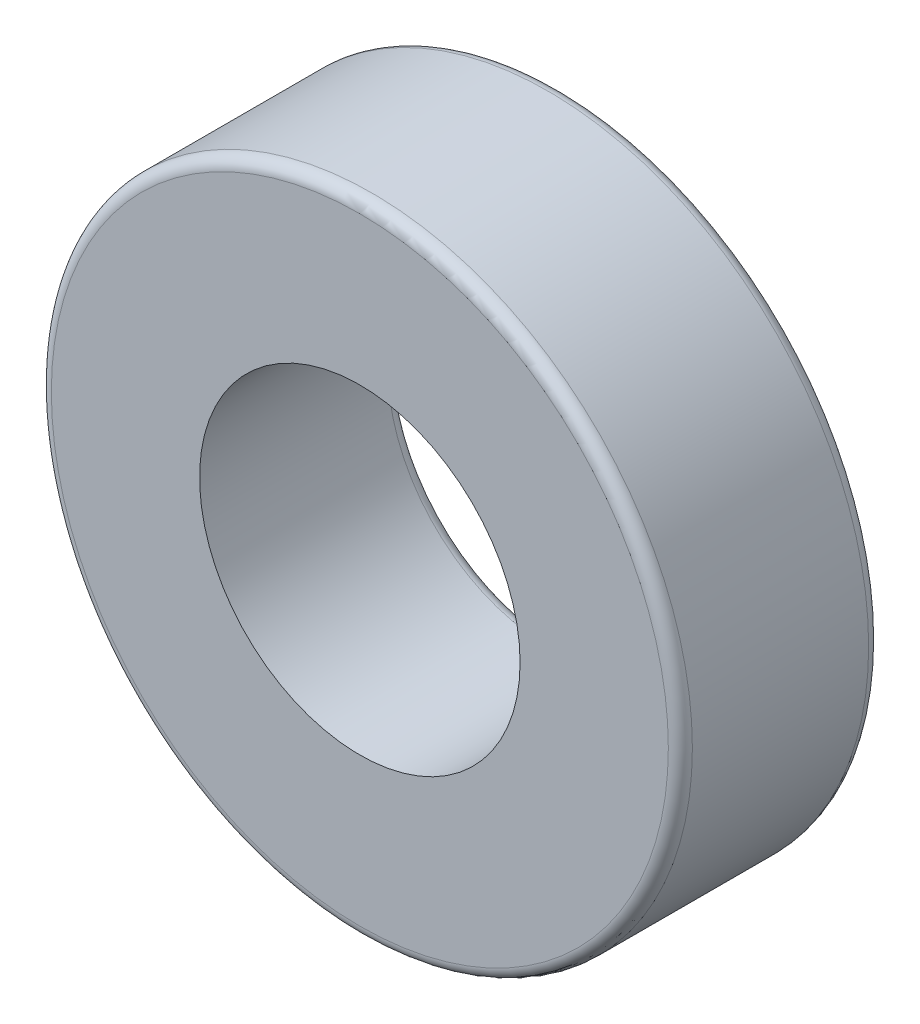
ISO-10303-21;
HEADER;
FILE_DESCRIPTION(('STEP AP214'),'2;1');
FILE_NAME('part.step','',(''),(''),'','','');
FILE_SCHEMA(('AUTOMOTIVE_DESIGN { 1 0 10303 214 1 1 1 1 }'));
ENDSEC;
DATA;
#1=APPLICATION_CONTEXT('core data for automotive mechanical design processes');
#2=APPLICATION_PROTOCOL_DEFINITION('international standard','automotive_design',2000,#1);
#3=PRODUCT_CONTEXT('',#1,'mechanical');
#4=PRODUCT('Part','Part','',(#3));
#5=PRODUCT_RELATED_PRODUCT_CATEGORY('part','',(#4));
#6=PRODUCT_DEFINITION_FORMATION('','',#4);
#7=PRODUCT_DEFINITION_CONTEXT('part definition',#1,'design');
#8=PRODUCT_DEFINITION('design','',#6,#7);
#9=PRODUCT_DEFINITION_SHAPE('','',#8);
#10=(LENGTH_UNIT() NAMED_UNIT(*) SI_UNIT(.MILLI.,.METRE.));
#11=(NAMED_UNIT(*) PLANE_ANGLE_UNIT() SI_UNIT($,.RADIAN.));
#12=(NAMED_UNIT(*) SI_UNIT($,.STERADIAN.) SOLID_ANGLE_UNIT());
#13=UNCERTAINTY_MEASURE_WITH_UNIT(LENGTH_MEASURE(1.E-05),#10,'distance_accuracy_value','');
#14=(GEOMETRIC_REPRESENTATION_CONTEXT(3) GLOBAL_UNCERTAINTY_ASSIGNED_CONTEXT((#13)) GLOBAL_UNIT_ASSIGNED_CONTEXT((#10,
#11,#12)) REPRESENTATION_CONTEXT('',''));
#15=CARTESIAN_POINT('',(0.,0.,0.));
#16=DIRECTION('',(0.,0.,1.));
#17=DIRECTION('',(1.,0.,0.));
#18=AXIS2_PLACEMENT_3D('',#15,#16,#17);
#19=CARTESIAN_POINT('',(0.,0.,2.5));
#20=DIRECTION('',(0.,0.,1.));
#21=DIRECTION('',(1.,0.,0.));
#22=AXIS2_PLACEMENT_3D('',#19,#20,#21);
#23=PLANE('',#22);
#24=CARTESIAN_POINT('',(0.,0.,2.5));
#25=DIRECTION('',(0.,0.,1.));
#26=DIRECTION('',(1.,0.,0.));
#27=AXIS2_PLACEMENT_3D('',#24,#25,#26);
#28=CIRCLE('',#27,7.7);
#29=CARTESIAN_POINT('',(7.7,0.,2.5));
#30=VERTEX_POINT('',#29);
#31=EDGE_CURVE('E50',#30,#30,#28,.T.);
#32=ORIENTED_EDGE('',*,*,#31,.T.);
#33=EDGE_LOOP('',(#32));
#34=FACE_BOUND('',#33,.T.);
#35=CARTESIAN_POINT('',(0.,0.,2.5));
#36=DIRECTION('',(0.,0.,1.));
#37=DIRECTION('',(1.,0.,0.));
#38=AXIS2_PLACEMENT_3D('',#35,#36,#37);
#39=CIRCLE('',#38,4.);
#40=CARTESIAN_POINT('',(4.,0.,2.5));
#41=VERTEX_POINT('',#40);
#42=EDGE_CURVE('E69',#41,#41,#39,.T.);
#43=ORIENTED_EDGE('',*,*,#42,.F.);
#44=EDGE_LOOP('',(#43));
#45=FACE_BOUND('',#44,.T.);
#46=ADVANCED_FACE('F37',(#34,#45),#23,.T.);
#47=CARTESIAN_POINT('',(0.,0.,-2.5));
#48=DIRECTION('',(0.,0.,1.));
#49=DIRECTION('',(1.,0.,0.));
#50=AXIS2_PLACEMENT_3D('',#47,#48,#49);
#51=PLANE('',#50);
#52=CARTESIAN_POINT('',(0.,0.,-2.5));
#53=DIRECTION('',(0.,0.,1.));
#54=DIRECTION('',(1.,0.,0.));
#55=AXIS2_PLACEMENT_3D('',#52,#53,#54);
#56=CIRCLE('',#55,4.3);
#57=CARTESIAN_POINT('',(4.3,0.,-2.5));
#58=VERTEX_POINT('',#57);
#59=EDGE_CURVE('E61',#58,#58,#56,.T.);
#60=ORIENTED_EDGE('',*,*,#59,.T.);
#61=EDGE_LOOP('',(#60));
#62=FACE_BOUND('',#61,.T.);
#63=CARTESIAN_POINT('',(0.,0.,-2.5));
#64=DIRECTION('',(0.,0.,1.));
#65=DIRECTION('',(1.,0.,0.));
#66=AXIS2_PLACEMENT_3D('',#63,#64,#65);
#67=CIRCLE('',#66,7.7);
#68=CARTESIAN_POINT('',(7.7,0.,-2.5));
#69=VERTEX_POINT('',#68);
#70=EDGE_CURVE('E65',#69,#69,#67,.F.);
#71=ORIENTED_EDGE('',*,*,#70,.T.);
#72=EDGE_LOOP('',(#71));
#73=FACE_BOUND('',#72,.T.);
#74=ADVANCED_FACE('F77',(#62,#73),#51,.F.);
#75=CARTESIAN_POINT('',(0.,0.,2.5));
#76=DIRECTION('',(0.,0.,-1.));
#77=DIRECTION('',(-1.,0.,0.));
#78=AXIS2_PLACEMENT_3D('',#75,#76,#77);
#79=CYLINDRICAL_SURFACE('',#78,8.);
#80=CARTESIAN_POINT('',(0.,0.,2.2));
#81=DIRECTION('',(0.,0.,1.));
#82=DIRECTION('',(1.,0.,0.));
#83=AXIS2_PLACEMENT_3D('',#80,#81,#82);
#84=CIRCLE('',#83,8.);
#85=CARTESIAN_POINT('',(8.,0.,2.2));
#86=VERTEX_POINT('',#85);
#87=EDGE_CURVE('E10',#86,#86,#84,.F.);
#88=ORIENTED_EDGE('',*,*,#87,.T.);
#89=EDGE_LOOP('',(#88));
#90=FACE_BOUND('',#89,.T.);
#91=CARTESIAN_POINT('',(0.,0.,-2.2));
#92=DIRECTION('',(0.,0.,1.));
#93=DIRECTION('',(1.,0.,0.));
#94=AXIS2_PLACEMENT_3D('',#91,#92,#93);
#95=CIRCLE('',#94,8.);
#96=CARTESIAN_POINT('',(8.,0.,-2.2));
#97=VERTEX_POINT('',#96);
#98=EDGE_CURVE('E45',#97,#97,#95,.T.);
#99=ORIENTED_EDGE('',*,*,#98,.T.);
#100=EDGE_LOOP('',(#99));
#101=FACE_BOUND('',#100,.T.);
#102=ADVANCED_FACE('F83',(#90,#101),#79,.T.);
#103=CARTESIAN_POINT('',(0.,0.,2.5));
#104=DIRECTION('',(0.,0.,-1.));
#105=DIRECTION('',(-1.,0.,0.));
#106=AXIS2_PLACEMENT_3D('',#103,#104,#105);
#107=CYLINDRICAL_SURFACE('',#106,4.);
#108=CARTESIAN_POINT('',(0.,0.,-2.2));
#109=DIRECTION('',(0.,0.,1.));
#110=DIRECTION('',(1.,0.,0.));
#111=AXIS2_PLACEMENT_3D('',#108,#109,#110);
#112=CIRCLE('',#111,4.);
#113=CARTESIAN_POINT('',(4.,0.,-2.2));
#114=VERTEX_POINT('',#113);
#115=EDGE_CURVE('E55',#114,#114,#112,.F.);
#116=ORIENTED_EDGE('',*,*,#115,.T.);
#117=EDGE_LOOP('',(#116));
#118=FACE_BOUND('',#117,.T.);
#119=ORIENTED_EDGE('',*,*,#42,.T.);
#120=EDGE_LOOP('',(#119));
#121=FACE_BOUND('',#120,.T.);
#122=ADVANCED_FACE('F74',(#118,#121),#107,.F.);
#123=CARTESIAN_POINT('',(0.,0.,-2.2));
#124=DIRECTION('',(0.,0.,1.));
#125=DIRECTION('',(1.,0.,0.));
#126=AXIS2_PLACEMENT_3D('',#123,#124,#125);
#127=TOROIDAL_SURFACE('',#126,4.3,0.3);
#128=ORIENTED_EDGE('',*,*,#115,.F.);
#129=EDGE_LOOP('',(#128));
#130=FACE_BOUND('',#129,.T.);
#131=ORIENTED_EDGE('',*,*,#59,.F.);
#132=EDGE_LOOP('',(#131));
#133=FACE_BOUND('',#132,.T.);
#134=ADVANCED_FACE('F90',(#130,#133),#127,.T.);
#135=CARTESIAN_POINT('',(0.,0.,2.2));
#136=DIRECTION('',(0.,0.,1.));
#137=DIRECTION('',(1.,0.,0.));
#138=AXIS2_PLACEMENT_3D('',#135,#136,#137);
#139=TOROIDAL_SURFACE('',#138,7.7,0.3);
#140=ORIENTED_EDGE('',*,*,#87,.F.);
#141=EDGE_LOOP('',(#140));
#142=FACE_BOUND('',#141,.T.);
#143=ORIENTED_EDGE('',*,*,#31,.F.);
#144=EDGE_LOOP('',(#143));
#145=FACE_BOUND('',#144,.T.);
#146=ADVANCED_FACE('F92',(#142,#145),#139,.T.);
#147=CARTESIAN_POINT('',(0.,0.,-2.2));
#148=DIRECTION('',(0.,0.,1.));
#149=DIRECTION('',(1.,0.,0.));
#150=AXIS2_PLACEMENT_3D('',#147,#148,#149);
#151=TOROIDAL_SURFACE('',#150,7.7,0.3);
#152=ORIENTED_EDGE('',*,*,#70,.F.);
#153=EDGE_LOOP('',(#152));
#154=FACE_BOUND('',#153,.T.);
#155=ORIENTED_EDGE('',*,*,#98,.F.);
#156=EDGE_LOOP('',(#155));
#157=FACE_BOUND('',#156,.T.);
#158=ADVANCED_FACE('F39',(#154,#157),#151,.T.);
#159=CLOSED_SHELL('',(#46,#74,#102,#122,#134,#146,#158));
#160=MANIFOLD_SOLID_BREP('B2',#159);
#161=ADVANCED_BREP_SHAPE_REPRESENTATION('',(#18,#160),#14);
#162=SHAPE_DEFINITION_REPRESENTATION(#9,#161);
ENDSEC;
END-ISO-10303-21;
